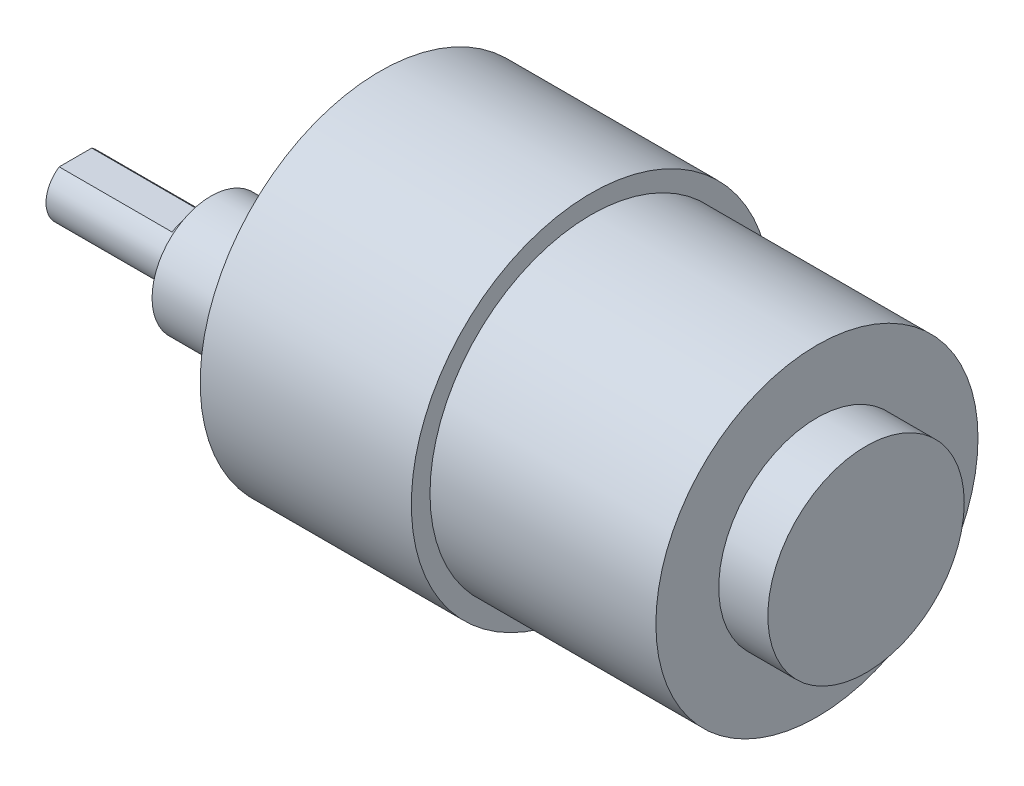
ISO-10303-21;
HEADER;
FILE_DESCRIPTION(('STEP AP214'),'2;1');
FILE_NAME('part.step','',(''),(''),'','','');
FILE_SCHEMA(('AUTOMOTIVE_DESIGN { 1 0 10303 214 1 1 1 1 }'));
ENDSEC;
DATA;
#1=APPLICATION_CONTEXT('core data for automotive mechanical design processes');
#2=APPLICATION_PROTOCOL_DEFINITION('international standard','automotive_design',2000,#1);
#3=PRODUCT_CONTEXT('',#1,'mechanical');
#4=PRODUCT('Part','Part','',(#3));
#5=PRODUCT_RELATED_PRODUCT_CATEGORY('part','',(#4));
#6=PRODUCT_DEFINITION_FORMATION('','',#4);
#7=PRODUCT_DEFINITION_CONTEXT('part definition',#1,'design');
#8=PRODUCT_DEFINITION('design','',#6,#7);
#9=PRODUCT_DEFINITION_SHAPE('','',#8);
#10=(LENGTH_UNIT() NAMED_UNIT(*) SI_UNIT(.MILLI.,.METRE.));
#11=(NAMED_UNIT(*) PLANE_ANGLE_UNIT() SI_UNIT($,.RADIAN.));
#12=(NAMED_UNIT(*) SI_UNIT($,.STERADIAN.) SOLID_ANGLE_UNIT());
#13=UNCERTAINTY_MEASURE_WITH_UNIT(LENGTH_MEASURE(1.E-05),#10,'distance_accuracy_value','');
#14=(GEOMETRIC_REPRESENTATION_CONTEXT(3) GLOBAL_UNCERTAINTY_ASSIGNED_CONTEXT((#13)) GLOBAL_UNIT_ASSIGNED_CONTEXT((#10,
#11,#12)) REPRESENTATION_CONTEXT('',''));
#15=CARTESIAN_POINT('',(0.,0.,0.));
#16=DIRECTION('',(0.,0.,1.));
#17=DIRECTION('',(1.,0.,0.));
#18=AXIS2_PLACEMENT_3D('',#15,#16,#17);
#19=CARTESIAN_POINT('',(45.2,0.,0.));
#20=DIRECTION('',(-1.,0.,0.));
#21=DIRECTION('',(0.,0.,1.));
#22=AXIS2_PLACEMENT_3D('',#19,#20,#21);
#23=CYLINDRICAL_SURFACE('',#22,18.3);
#24=CARTESIAN_POINT('',(45.2,0.,0.));
#25=DIRECTION('',(1.,0.,0.));
#26=DIRECTION('',(0.,0.,-1.));
#27=AXIS2_PLACEMENT_3D('',#24,#25,#26);
#28=CIRCLE('',#27,18.3);
#29=CARTESIAN_POINT('',(45.2,0.,-18.3));
#30=VERTEX_POINT('',#29);
#31=EDGE_CURVE('E131',#30,#30,#28,.T.);
#32=ORIENTED_EDGE('',*,*,#31,.F.);
#33=EDGE_LOOP('',(#32));
#34=FACE_BOUND('',#33,.T.);
#35=CARTESIAN_POINT('',(23.7,0.,0.));
#36=DIRECTION('',(1.,0.,0.));
#37=DIRECTION('',(0.,0.,-1.));
#38=AXIS2_PLACEMENT_3D('',#35,#36,#37);
#39=CIRCLE('',#38,18.3);
#40=CARTESIAN_POINT('',(23.7,0.,-18.3));
#41=VERTEX_POINT('',#40);
#42=EDGE_CURVE('E128',#41,#41,#39,.T.);
#43=ORIENTED_EDGE('',*,*,#42,.T.);
#44=EDGE_LOOP('',(#43));
#45=FACE_BOUND('',#44,.T.);
#46=ADVANCED_FACE('F35',(#34,#45),#23,.T.);
#47=CARTESIAN_POINT('',(45.2,0.,0.));
#48=DIRECTION('',(1.,0.,0.));
#49=DIRECTION('',(0.,0.,-1.));
#50=AXIS2_PLACEMENT_3D('',#47,#48,#49);
#51=PLANE('',#50);
#52=CARTESIAN_POINT('',(45.2,0.,0.));
#53=DIRECTION('',(1.,0.,0.));
#54=DIRECTION('',(0.,0.,-1.));
#55=AXIS2_PLACEMENT_3D('',#52,#53,#54);
#56=CIRCLE('',#55,16.4);
#57=CARTESIAN_POINT('',(45.2,0.,-16.4));
#58=VERTEX_POINT('',#57);
#59=EDGE_CURVE('E125',#58,#58,#56,.T.);
#60=ORIENTED_EDGE('',*,*,#59,.F.);
#61=EDGE_LOOP('',(#60));
#62=FACE_BOUND('',#61,.T.);
#63=ORIENTED_EDGE('',*,*,#31,.T.);
#64=EDGE_LOOP('',(#63));
#65=FACE_BOUND('',#64,.T.);
#66=ADVANCED_FACE('F144',(#62,#65),#51,.T.);
#67=CARTESIAN_POINT('',(23.7,0.,0.));
#68=DIRECTION('',(1.,0.,0.));
#69=DIRECTION('',(0.,0.,-1.));
#70=AXIS2_PLACEMENT_3D('',#67,#68,#69);
#71=PLANE('',#70);
#72=CARTESIAN_POINT('',(23.7,0.,7.3));
#73=DIRECTION('',(1.,0.,0.));
#74=DIRECTION('',(0.,0.,-1.));
#75=AXIS2_PLACEMENT_3D('',#72,#73,#74);
#76=CIRCLE('',#75,6.);
#77=CARTESIAN_POINT('',(23.7,0.,1.3));
#78=VERTEX_POINT('',#77);
#79=EDGE_CURVE('E81',#78,#78,#76,.F.);
#80=ORIENTED_EDGE('',*,*,#79,.F.);
#81=EDGE_LOOP('',(#80));
#82=FACE_BOUND('',#81,.T.);
#83=CARTESIAN_POINT('',(23.7,7.75000000000016,-13.4233937586587));
#84=DIRECTION('',(-1.,0.,0.));
#85=DIRECTION('',(0.,0.866025403784433,0.50000000000001));
#86=AXIS2_PLACEMENT_3D('',#83,#84,#85);
#87=CIRCLE('',#86,1.5);
#88=CARTESIAN_POINT('',(23.7,9.04903810567681,-12.6733937586587));
#89=VERTEX_POINT('',#88);
#90=EDGE_CURVE('E76',#89,#89,#87,.T.);
#91=ORIENTED_EDGE('',*,*,#90,.F.);
#92=EDGE_LOOP('',(#91));
#93=FACE_BOUND('',#92,.T.);
#94=CARTESIAN_POINT('',(23.7,-7.74999999999987,-13.4233937586589));
#95=DIRECTION('',(-1.,0.,0.));
#96=DIRECTION('',(0.,0.866025403784443,-0.499999999999992));
#97=AXIS2_PLACEMENT_3D('',#94,#95,#96);
#98=CIRCLE('',#97,1.5);
#99=CARTESIAN_POINT('',(23.7,-6.45096189432321,-14.1733937586589));
#100=VERTEX_POINT('',#99);
#101=EDGE_CURVE('E99',#100,#100,#98,.T.);
#102=ORIENTED_EDGE('',*,*,#101,.F.);
#103=EDGE_LOOP('',(#102));
#104=FACE_BOUND('',#103,.T.);
#105=CARTESIAN_POINT('',(23.7,-15.5,0.));
#106=DIRECTION('',(-1.,0.,0.));
#107=DIRECTION('',(0.,0.,-1.));
#108=AXIS2_PLACEMENT_3D('',#105,#106,#107);
#109=CIRCLE('',#108,1.5);
#110=CARTESIAN_POINT('',(23.7,-15.5,-1.5));
#111=VERTEX_POINT('',#110);
#112=EDGE_CURVE('E93',#111,#111,#109,.T.);
#113=ORIENTED_EDGE('',*,*,#112,.F.);
#114=EDGE_LOOP('',(#113));
#115=FACE_BOUND('',#114,.T.);
#116=CARTESIAN_POINT('',(23.7,-7.75000000000006,13.4233937586588));
#117=DIRECTION('',(-1.,0.,0.));
#118=DIRECTION('',(0.,-0.866025403784436,-0.500000000000004));
#119=AXIS2_PLACEMENT_3D('',#116,#117,#118);
#120=CIRCLE('',#119,1.5);
#121=CARTESIAN_POINT('',(23.7,-9.04903810567672,12.6733937586588));
#122=VERTEX_POINT('',#121);
#123=EDGE_CURVE('E87',#122,#122,#120,.T.);
#124=ORIENTED_EDGE('',*,*,#123,.F.);
#125=EDGE_LOOP('',(#124));
#126=FACE_BOUND('',#125,.T.);
#127=CARTESIAN_POINT('',(23.7,7.74999999999997,13.4233937586588));
#128=DIRECTION('',(-1.,0.,0.));
#129=DIRECTION('',(0.,-0.86602540378444,0.499999999999998));
#130=AXIS2_PLACEMENT_3D('',#127,#128,#129);
#131=CIRCLE('',#130,1.5);
#132=CARTESIAN_POINT('',(23.7,6.45096189432331,14.1733937586588));
#133=VERTEX_POINT('',#132);
#134=EDGE_CURVE('E86',#133,#133,#131,.T.);
#135=ORIENTED_EDGE('',*,*,#134,.F.);
#136=EDGE_LOOP('',(#135));
#137=FACE_BOUND('',#136,.T.);
#138=CARTESIAN_POINT('',(23.7,15.5,0.));
#139=DIRECTION('',(-1.,0.,0.));
#140=DIRECTION('',(0.,0.,1.));
#141=AXIS2_PLACEMENT_3D('',#138,#139,#140);
#142=CIRCLE('',#141,1.5);
#143=CARTESIAN_POINT('',(23.7,15.5,1.5));
#144=VERTEX_POINT('',#143);
#145=EDGE_CURVE('E110',#144,#144,#142,.T.);
#146=ORIENTED_EDGE('',*,*,#145,.F.);
#147=EDGE_LOOP('',(#146));
#148=FACE_BOUND('',#147,.T.);
#149=ORIENTED_EDGE('',*,*,#42,.F.);
#150=EDGE_LOOP('',(#149));
#151=FACE_BOUND('',#150,.T.);
#152=ADVANCED_FACE('F140',(#82,#93,#104,#115,#126,#137,#148,#151),#71,.F.);
#153=CARTESIAN_POINT('',(68.2,0.,0.));
#154=DIRECTION('',(-1.,0.,0.));
#155=DIRECTION('',(0.,0.,1.));
#156=AXIS2_PLACEMENT_3D('',#153,#154,#155);
#157=CYLINDRICAL_SURFACE('',#156,16.4);
#158=CARTESIAN_POINT('',(68.2,0.,0.));
#159=DIRECTION('',(1.,0.,0.));
#160=DIRECTION('',(0.,0.,-1.));
#161=AXIS2_PLACEMENT_3D('',#158,#159,#160);
#162=CIRCLE('',#161,16.4);
#163=CARTESIAN_POINT('',(68.2,0.,-16.4));
#164=VERTEX_POINT('',#163);
#165=EDGE_CURVE('E121',#164,#164,#162,.T.);
#166=ORIENTED_EDGE('',*,*,#165,.F.);
#167=EDGE_LOOP('',(#166));
#168=FACE_BOUND('',#167,.T.);
#169=ORIENTED_EDGE('',*,*,#59,.T.);
#170=EDGE_LOOP('',(#169));
#171=FACE_BOUND('',#170,.T.);
#172=ADVANCED_FACE('F143',(#168,#171),#157,.T.);
#173=CARTESIAN_POINT('',(68.2,0.,0.));
#174=DIRECTION('',(1.,0.,0.));
#175=DIRECTION('',(0.,0.,-1.));
#176=AXIS2_PLACEMENT_3D('',#173,#174,#175);
#177=PLANE('',#176);
#178=CARTESIAN_POINT('',(68.2,0.,0.));
#179=DIRECTION('',(1.,0.,0.));
#180=DIRECTION('',(0.,0.,-1.));
#181=AXIS2_PLACEMENT_3D('',#178,#179,#180);
#182=CIRCLE('',#181,10.);
#183=CARTESIAN_POINT('',(68.2,0.,-10.));
#184=VERTEX_POINT('',#183);
#185=EDGE_CURVE('E122',#184,#184,#182,.T.);
#186=ORIENTED_EDGE('',*,*,#185,.F.);
#187=EDGE_LOOP('',(#186));
#188=FACE_BOUND('',#187,.T.);
#189=ORIENTED_EDGE('',*,*,#165,.T.);
#190=EDGE_LOOP('',(#189));
#191=FACE_BOUND('',#190,.T.);
#192=ADVANCED_FACE('F174',(#188,#191),#177,.T.);
#193=CARTESIAN_POINT('',(73.2,0.,0.));
#194=DIRECTION('',(-1.,0.,0.));
#195=DIRECTION('',(0.,0.,1.));
#196=AXIS2_PLACEMENT_3D('',#193,#194,#195);
#197=CYLINDRICAL_SURFACE('',#196,10.);
#198=CARTESIAN_POINT('',(73.2,0.,0.));
#199=DIRECTION('',(1.,0.,0.));
#200=DIRECTION('',(0.,0.,-1.));
#201=AXIS2_PLACEMENT_3D('',#198,#199,#200);
#202=CIRCLE('',#201,10.);
#203=CARTESIAN_POINT('',(73.2,0.,-10.));
#204=VERTEX_POINT('',#203);
#205=EDGE_CURVE('E116',#204,#204,#202,.T.);
#206=ORIENTED_EDGE('',*,*,#205,.F.);
#207=EDGE_LOOP('',(#206));
#208=FACE_BOUND('',#207,.T.);
#209=ORIENTED_EDGE('',*,*,#185,.T.);
#210=EDGE_LOOP('',(#209));
#211=FACE_BOUND('',#210,.T.);
#212=ADVANCED_FACE('F178',(#208,#211),#197,.T.);
#213=CARTESIAN_POINT('',(73.2,0.,0.));
#214=DIRECTION('',(1.,0.,0.));
#215=DIRECTION('',(0.,0.,-1.));
#216=AXIS2_PLACEMENT_3D('',#213,#214,#215);
#217=PLANE('',#216);
#218=ORIENTED_EDGE('',*,*,#205,.T.);
#219=EDGE_LOOP('',(#218));
#220=FACE_BOUND('',#219,.T.);
#221=ADVANCED_FACE('F182',(#220),#217,.T.);
#222=CARTESIAN_POINT('',(28.7,15.5,0.));
#223=DIRECTION('',(-1.,0.,0.));
#224=DIRECTION('',(0.,0.,1.));
#225=AXIS2_PLACEMENT_3D('',#222,#223,#224);
#226=CYLINDRICAL_SURFACE('',#225,1.5);
#227=CARTESIAN_POINT('',(28.7,15.5,0.));
#228=DIRECTION('',(-1.,0.,0.));
#229=DIRECTION('',(0.,0.,1.));
#230=AXIS2_PLACEMENT_3D('',#227,#228,#229);
#231=CIRCLE('',#230,1.5);
#232=CARTESIAN_POINT('',(28.7,15.5,1.5));
#233=VERTEX_POINT('',#232);
#234=EDGE_CURVE('E113',#233,#233,#231,.T.);
#235=ORIENTED_EDGE('',*,*,#234,.F.);
#236=EDGE_LOOP('',(#235));
#237=FACE_BOUND('',#236,.T.);
#238=ORIENTED_EDGE('',*,*,#145,.T.);
#239=EDGE_LOOP('',(#238));
#240=FACE_BOUND('',#239,.T.);
#241=ADVANCED_FACE('F186',(#237,#240),#226,.F.);
#242=CARTESIAN_POINT('',(28.7,15.5,0.));
#243=DIRECTION('',(-1.,0.,0.));
#244=DIRECTION('',(0.,0.,1.));
#245=AXIS2_PLACEMENT_3D('',#242,#243,#244);
#246=PLANE('',#245);
#247=ORIENTED_EDGE('',*,*,#234,.T.);
#248=EDGE_LOOP('',(#247));
#249=FACE_BOUND('',#248,.T.);
#250=ADVANCED_FACE('F190',(#249),#246,.T.);
#251=CARTESIAN_POINT('',(28.7,7.74999999999997,13.4233937586588));
#252=DIRECTION('',(-1.,0.,0.));
#253=DIRECTION('',(0.,0.,1.));
#254=AXIS2_PLACEMENT_3D('',#251,#252,#253);
#255=CYLINDRICAL_SURFACE('',#254,1.5);
#256=CARTESIAN_POINT('',(28.7,7.74999999999997,13.4233937586588));
#257=DIRECTION('',(-1.,0.,0.));
#258=DIRECTION('',(0.,-0.86602540378444,0.499999999999998));
#259=AXIS2_PLACEMENT_3D('',#256,#257,#258);
#260=CIRCLE('',#259,1.5);
#261=CARTESIAN_POINT('',(28.7,6.45096189432331,14.1733937586588));
#262=VERTEX_POINT('',#261);
#263=EDGE_CURVE('E107',#262,#262,#260,.T.);
#264=ORIENTED_EDGE('',*,*,#263,.F.);
#265=EDGE_LOOP('',(#264));
#266=FACE_BOUND('',#265,.T.);
#267=ORIENTED_EDGE('',*,*,#134,.T.);
#268=EDGE_LOOP('',(#267));
#269=FACE_BOUND('',#268,.T.);
#270=ADVANCED_FACE('F194',(#266,#269),#255,.F.);
#271=CARTESIAN_POINT('',(28.7,7.74999999999997,13.4233937586588));
#272=DIRECTION('',(-1.,0.,0.));
#273=DIRECTION('',(0.,-0.86602540378444,0.499999999999998));
#274=AXIS2_PLACEMENT_3D('',#271,#272,#273);
#275=PLANE('',#274);
#276=ORIENTED_EDGE('',*,*,#263,.T.);
#277=EDGE_LOOP('',(#276));
#278=FACE_BOUND('',#277,.T.);
#279=ADVANCED_FACE('F198',(#278),#275,.T.);
#280=CARTESIAN_POINT('',(28.7,-7.75000000000006,13.4233937586588));
#281=DIRECTION('',(-1.,0.,0.));
#282=DIRECTION('',(0.,0.,1.));
#283=AXIS2_PLACEMENT_3D('',#280,#281,#282);
#284=CYLINDRICAL_SURFACE('',#283,1.5);
#285=CARTESIAN_POINT('',(28.7,-7.75000000000006,13.4233937586588));
#286=DIRECTION('',(-1.,0.,0.));
#287=DIRECTION('',(0.,-0.866025403784436,-0.500000000000004));
#288=AXIS2_PLACEMENT_3D('',#285,#286,#287);
#289=CIRCLE('',#288,1.5);
#290=CARTESIAN_POINT('',(28.7,-9.04903810567672,12.6733937586588));
#291=VERTEX_POINT('',#290);
#292=EDGE_CURVE('E83',#291,#291,#289,.T.);
#293=ORIENTED_EDGE('',*,*,#292,.F.);
#294=EDGE_LOOP('',(#293));
#295=FACE_BOUND('',#294,.T.);
#296=ORIENTED_EDGE('',*,*,#123,.T.);
#297=EDGE_LOOP('',(#296));
#298=FACE_BOUND('',#297,.T.);
#299=ADVANCED_FACE('F202',(#295,#298),#284,.F.);
#300=CARTESIAN_POINT('',(28.7,-7.75000000000006,13.4233937586588));
#301=DIRECTION('',(-1.,0.,0.));
#302=DIRECTION('',(0.,-0.866025403784436,-0.500000000000004));
#303=AXIS2_PLACEMENT_3D('',#300,#301,#302);
#304=PLANE('',#303);
#305=ORIENTED_EDGE('',*,*,#292,.T.);
#306=EDGE_LOOP('',(#305));
#307=FACE_BOUND('',#306,.T.);
#308=ADVANCED_FACE('F224',(#307),#304,.T.);
#309=CARTESIAN_POINT('',(28.7,-15.5,0.));
#310=DIRECTION('',(-1.,0.,0.));
#311=DIRECTION('',(0.,0.,1.));
#312=AXIS2_PLACEMENT_3D('',#309,#310,#311);
#313=CYLINDRICAL_SURFACE('',#312,1.5);
#314=CARTESIAN_POINT('',(28.7,-15.5,0.));
#315=DIRECTION('',(-1.,0.,0.));
#316=DIRECTION('',(0.,0.,-1.));
#317=AXIS2_PLACEMENT_3D('',#314,#315,#316);
#318=CIRCLE('',#317,1.5);
#319=CARTESIAN_POINT('',(28.7,-15.5,-1.5));
#320=VERTEX_POINT('',#319);
#321=EDGE_CURVE('E90',#320,#320,#318,.T.);
#322=ORIENTED_EDGE('',*,*,#321,.F.);
#323=EDGE_LOOP('',(#322));
#324=FACE_BOUND('',#323,.T.);
#325=ORIENTED_EDGE('',*,*,#112,.T.);
#326=EDGE_LOOP('',(#325));
#327=FACE_BOUND('',#326,.T.);
#328=ADVANCED_FACE('F221',(#324,#327),#313,.F.);
#329=CARTESIAN_POINT('',(28.7,-15.5,0.));
#330=DIRECTION('',(-1.,0.,0.));
#331=DIRECTION('',(0.,0.,-1.));
#332=AXIS2_PLACEMENT_3D('',#329,#330,#331);
#333=PLANE('',#332);
#334=ORIENTED_EDGE('',*,*,#321,.T.);
#335=EDGE_LOOP('',(#334));
#336=FACE_BOUND('',#335,.T.);
#337=ADVANCED_FACE('F216',(#336),#333,.T.);
#338=CARTESIAN_POINT('',(28.7,-7.74999999999987,-13.4233937586589));
#339=DIRECTION('',(-1.,0.,0.));
#340=DIRECTION('',(0.,0.,1.));
#341=AXIS2_PLACEMENT_3D('',#338,#339,#340);
#342=CYLINDRICAL_SURFACE('',#341,1.5);
#343=CARTESIAN_POINT('',(28.7,-7.74999999999987,-13.4233937586589));
#344=DIRECTION('',(-1.,0.,0.));
#345=DIRECTION('',(0.,0.866025403784443,-0.499999999999992));
#346=AXIS2_PLACEMENT_3D('',#343,#344,#345);
#347=CIRCLE('',#346,1.5);
#348=CARTESIAN_POINT('',(28.7,-6.45096189432321,-14.1733937586589));
#349=VERTEX_POINT('',#348);
#350=EDGE_CURVE('E96',#349,#349,#347,.T.);
#351=ORIENTED_EDGE('',*,*,#350,.F.);
#352=EDGE_LOOP('',(#351));
#353=FACE_BOUND('',#352,.T.);
#354=ORIENTED_EDGE('',*,*,#101,.T.);
#355=EDGE_LOOP('',(#354));
#356=FACE_BOUND('',#355,.T.);
#357=ADVANCED_FACE('F213',(#353,#356),#342,.F.);
#358=CARTESIAN_POINT('',(28.7,-7.74999999999987,-13.4233937586589));
#359=DIRECTION('',(-1.,0.,0.));
#360=DIRECTION('',(0.,0.866025403784443,-0.499999999999992));
#361=AXIS2_PLACEMENT_3D('',#358,#359,#360);
#362=PLANE('',#361);
#363=ORIENTED_EDGE('',*,*,#350,.T.);
#364=EDGE_LOOP('',(#363));
#365=FACE_BOUND('',#364,.T.);
#366=ADVANCED_FACE('F208',(#365),#362,.T.);
#367=CARTESIAN_POINT('',(28.7,7.75000000000016,-13.4233937586587));
#368=DIRECTION('',(-1.,0.,0.));
#369=DIRECTION('',(0.,0.,1.));
#370=AXIS2_PLACEMENT_3D('',#367,#368,#369);
#371=CYLINDRICAL_SURFACE('',#370,1.5);
#372=CARTESIAN_POINT('',(28.7,7.75000000000016,-13.4233937586587));
#373=DIRECTION('',(-1.,0.,0.));
#374=DIRECTION('',(0.,0.866025403784433,0.50000000000001));
#375=AXIS2_PLACEMENT_3D('',#372,#373,#374);
#376=CIRCLE('',#375,1.5);
#377=CARTESIAN_POINT('',(28.7,9.04903810567681,-12.6733937586587));
#378=VERTEX_POINT('',#377);
#379=EDGE_CURVE('E102',#378,#378,#376,.T.);
#380=ORIENTED_EDGE('',*,*,#379,.F.);
#381=EDGE_LOOP('',(#380));
#382=FACE_BOUND('',#381,.T.);
#383=ORIENTED_EDGE('',*,*,#90,.T.);
#384=EDGE_LOOP('',(#383));
#385=FACE_BOUND('',#384,.T.);
#386=ADVANCED_FACE('F204',(#382,#385),#371,.F.);
#387=CARTESIAN_POINT('',(28.7,7.75000000000016,-13.4233937586587));
#388=DIRECTION('',(-1.,0.,0.));
#389=DIRECTION('',(0.,0.866025403784433,0.50000000000001));
#390=AXIS2_PLACEMENT_3D('',#387,#388,#389);
#391=PLANE('',#390);
#392=ORIENTED_EDGE('',*,*,#379,.T.);
#393=EDGE_LOOP('',(#392));
#394=FACE_BOUND('',#393,.T.);
#395=ADVANCED_FACE('F207',(#394),#391,.T.);
#396=CARTESIAN_POINT('',(13.8,0.,7.3));
#397=DIRECTION('',(1.,0.,0.));
#398=DIRECTION('',(0.,0.,-1.));
#399=AXIS2_PLACEMENT_3D('',#396,#397,#398);
#400=CYLINDRICAL_SURFACE('',#399,6.);
#401=CARTESIAN_POINT('',(13.8,0.,7.3));
#402=DIRECTION('',(-1.,0.,0.));
#403=DIRECTION('',(0.,0.,1.));
#404=AXIS2_PLACEMENT_3D('',#401,#402,#403);
#405=CIRCLE('',#404,6.);
#406=CARTESIAN_POINT('',(13.8,0.,13.3));
#407=VERTEX_POINT('',#406);
#408=EDGE_CURVE('E73',#407,#407,#405,.T.);
#409=ORIENTED_EDGE('',*,*,#408,.F.);
#410=EDGE_LOOP('',(#409));
#411=FACE_BOUND('',#410,.T.);
#412=ORIENTED_EDGE('',*,*,#79,.T.);
#413=EDGE_LOOP('',(#412));
#414=FACE_BOUND('',#413,.T.);
#415=ADVANCED_FACE('F138',(#411,#414),#400,.T.);
#416=CARTESIAN_POINT('',(13.8,0.,7.3));
#417=DIRECTION('',(-1.,0.,0.));
#418=DIRECTION('',(0.,0.,1.));
#419=AXIS2_PLACEMENT_3D('',#416,#417,#418);
#420=PLANE('',#419);
#421=CARTESIAN_POINT('',(13.8,0.,7.3));
#422=DIRECTION('',(-1.,0.,0.));
#423=DIRECTION('',(0.,0.,1.));
#424=AXIS2_PLACEMENT_3D('',#421,#422,#423);
#425=CIRCLE('',#424,3.);
#426=CARTESIAN_POINT('',(13.8,0.,10.3));
#427=VERTEX_POINT('',#426);
#428=EDGE_CURVE('E42',#427,#427,#425,.T.);
#429=ORIENTED_EDGE('',*,*,#428,.F.);
#430=EDGE_LOOP('',(#429));
#431=FACE_BOUND('',#430,.T.);
#432=ORIENTED_EDGE('',*,*,#408,.T.);
#433=EDGE_LOOP('',(#432));
#434=FACE_BOUND('',#433,.T.);
#435=ADVANCED_FACE('F237',(#431,#434),#420,.T.);
#436=CARTESIAN_POINT('',(0.,0.,7.3));
#437=DIRECTION('',(1.,0.,0.));
#438=DIRECTION('',(0.,0.,-1.));
#439=AXIS2_PLACEMENT_3D('',#436,#437,#438);
#440=CYLINDRICAL_SURFACE('',#439,3.);
#441=CARTESIAN_POINT('',(0.,0.,7.3));
#442=DIRECTION('',(-1.,0.,0.));
#443=DIRECTION('',(0.,0.,1.));
#444=AXIS2_PLACEMENT_3D('',#441,#442,#443);
#445=CIRCLE('',#444,3.);
#446=CARTESIAN_POINT('',(0.,2.5,5.6416876048223));
#447=VERTEX_POINT('',#446);
#448=CARTESIAN_POINT('',(0.,2.5,8.9583123951777));
#449=VERTEX_POINT('',#448);
#450=EDGE_CURVE('E70',#447,#449,#445,.T.);
#451=ORIENTED_EDGE('',*,*,#450,.F.);
#452=DIRECTION('',(-1.,0.,0.));
#453=VECTOR('',#452,1.);
#454=CARTESIAN_POINT('',(11.5,2.5,5.6416876048223));
#455=LINE('',#454,#453);
#456=CARTESIAN_POINT('',(11.5,2.5,5.6416876048223));
#457=VERTEX_POINT('',#456);
#458=EDGE_CURVE('E49',#457,#447,#455,.T.);
#459=ORIENTED_EDGE('',*,*,#458,.F.);
#460=CARTESIAN_POINT('',(11.5,0.,7.3));
#461=DIRECTION('',(1.,0.,0.));
#462=DIRECTION('',(0.,0.,-1.));
#463=AXIS2_PLACEMENT_3D('',#460,#461,#462);
#464=CIRCLE('',#463,3.);
#465=CARTESIAN_POINT('',(11.5,2.5,8.9583123951777));
#466=VERTEX_POINT('',#465);
#467=EDGE_CURVE('E11',#457,#466,#464,.T.);
#468=ORIENTED_EDGE('',*,*,#467,.T.);
#469=DIRECTION('',(-1.,0.,0.));
#470=VECTOR('',#469,1.);
#471=CARTESIAN_POINT('',(11.5,2.5,8.9583123951777));
#472=LINE('',#471,#470);
#473=EDGE_CURVE('E55',#466,#449,#472,.T.);
#474=ORIENTED_EDGE('',*,*,#473,.T.);
#475=EDGE_LOOP('',(#451,#459,#468,#474));
#476=FACE_BOUND('',#475,.T.);
#477=ORIENTED_EDGE('',*,*,#428,.T.);
#478=EDGE_LOOP('',(#477));
#479=FACE_BOUND('',#478,.T.);
#480=ADVANCED_FACE('F68',(#476,#479),#440,.T.);
#481=CARTESIAN_POINT('',(0.,0.,7.3));
#482=DIRECTION('',(-1.,0.,0.));
#483=DIRECTION('',(0.,0.,1.));
#484=AXIS2_PLACEMENT_3D('',#481,#482,#483);
#485=PLANE('',#484);
#486=DIRECTION('',(0.,0.,1.));
#487=VECTOR('',#486,1.);
#488=CARTESIAN_POINT('',(0.,2.5,5.6416876048223));
#489=LINE('',#488,#487);
#490=EDGE_CURVE('E60',#447,#449,#489,.T.);
#491=ORIENTED_EDGE('',*,*,#490,.F.);
#492=ORIENTED_EDGE('',*,*,#450,.T.);
#493=EDGE_LOOP('',(#491,#492));
#494=FACE_BOUND('',#493,.T.);
#495=ADVANCED_FACE('F72',(#494),#485,.T.);
#496=CARTESIAN_POINT('',(11.5,0.,0.));
#497=DIRECTION('',(1.,0.,0.));
#498=DIRECTION('',(0.,0.,-1.));
#499=AXIS2_PLACEMENT_3D('',#496,#497,#498);
#500=PLANE('',#499);
#501=DIRECTION('',(0.,0.,1.));
#502=VECTOR('',#501,1.);
#503=CARTESIAN_POINT('',(11.5,2.5,5.6416876048223));
#504=LINE('',#503,#502);
#505=EDGE_CURVE('E65',#457,#466,#504,.T.);
#506=ORIENTED_EDGE('',*,*,#505,.T.);
#507=ORIENTED_EDGE('',*,*,#467,.F.);
#508=EDGE_LOOP('',(#506,#507));
#509=FACE_BOUND('',#508,.T.);
#510=ADVANCED_FACE('F246',(#509),#500,.F.);
#511=CARTESIAN_POINT('',(11.5,2.5,5.6416876048223));
#512=DIRECTION('',(0.,-1.,0.));
#513=DIRECTION('',(0.,0.,-1.));
#514=AXIS2_PLACEMENT_3D('',#511,#512,#513);
#515=PLANE('',#514);
#516=ORIENTED_EDGE('',*,*,#490,.T.);
#517=ORIENTED_EDGE('',*,*,#473,.F.);
#518=ORIENTED_EDGE('',*,*,#505,.F.);
#519=ORIENTED_EDGE('',*,*,#458,.T.);
#520=EDGE_LOOP('',(#516,#517,#518,#519));
#521=FACE_BOUND('',#520,.T.);
#522=ADVANCED_FACE('F61',(#521),#515,.F.);
#523=CLOSED_SHELL('',(#46,#66,#152,#172,#192,#212,#221,#241,#250,#270,#279,#299,#308,#328,#337,
#357,#366,#386,#395,#415,#435,#480,#495,#510,#522));
#524=MANIFOLD_SOLID_BREP('B2',#523);
#525=ADVANCED_BREP_SHAPE_REPRESENTATION('',(#18,#524),#14);
#526=SHAPE_DEFINITION_REPRESENTATION(#9,#525);
ENDSEC;
END-ISO-10303-21;
